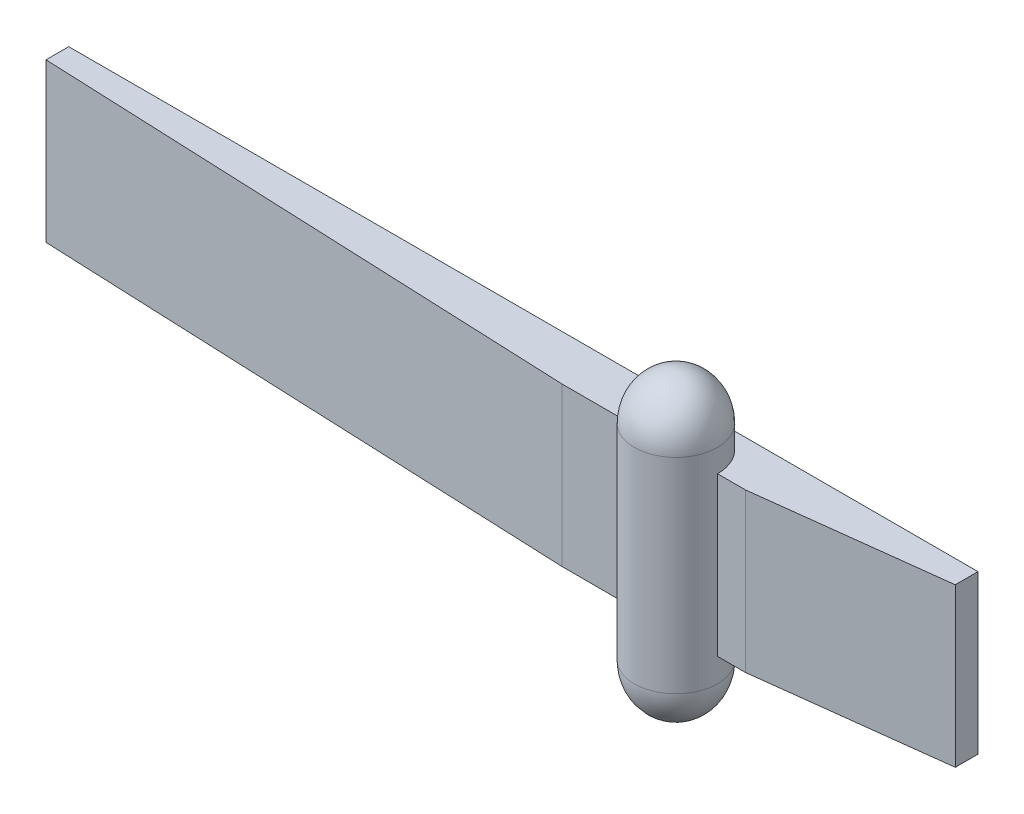
ISO-10303-21;
HEADER;
FILE_DESCRIPTION(('STEP AP214'),'2;1');
FILE_NAME('part.step','',(''),(''),'','','');
FILE_SCHEMA(('AUTOMOTIVE_DESIGN { 1 0 10303 214 1 1 1 1 }'));
ENDSEC;
DATA;
#1=APPLICATION_CONTEXT('core data for automotive mechanical design processes');
#2=APPLICATION_PROTOCOL_DEFINITION('international standard','automotive_design',2000,#1);
#3=PRODUCT_CONTEXT('',#1,'mechanical');
#4=PRODUCT('Part','Part','',(#3));
#5=PRODUCT_RELATED_PRODUCT_CATEGORY('part','',(#4));
#6=PRODUCT_DEFINITION_FORMATION('','',#4);
#7=PRODUCT_DEFINITION_CONTEXT('part definition',#1,'design');
#8=PRODUCT_DEFINITION('design','',#6,#7);
#9=PRODUCT_DEFINITION_SHAPE('','',#8);
#10=(LENGTH_UNIT() NAMED_UNIT(*) SI_UNIT(.MILLI.,.METRE.));
#11=(NAMED_UNIT(*) PLANE_ANGLE_UNIT() SI_UNIT($,.RADIAN.));
#12=(NAMED_UNIT(*) SI_UNIT($,.STERADIAN.) SOLID_ANGLE_UNIT());
#13=UNCERTAINTY_MEASURE_WITH_UNIT(LENGTH_MEASURE(1.E-05),#10,'distance_accuracy_value','');
#14=(GEOMETRIC_REPRESENTATION_CONTEXT(3) GLOBAL_UNCERTAINTY_ASSIGNED_CONTEXT((#13)) GLOBAL_UNIT_ASSIGNED_CONTEXT((#10,
#11,#12)) REPRESENTATION_CONTEXT('',''));
#15=CARTESIAN_POINT('',(0.,0.,0.));
#16=DIRECTION('',(0.,0.,1.));
#17=DIRECTION('',(1.,0.,0.));
#18=AXIS2_PLACEMENT_3D('',#15,#16,#17);
#19=CARTESIAN_POINT('',(0.,0.,10.));
#20=DIRECTION('',(0.,0.,1.));
#21=DIRECTION('',(1.,0.,0.));
#22=AXIS2_PLACEMENT_3D('',#19,#20,#21);
#23=PLANE('',#22);
#24=DIRECTION('',(0.,1.,0.));
#25=VECTOR('',#24,1.);
#26=CARTESIAN_POINT('',(102.312904094759,-41.9286147711512,10.));
#27=LINE('',#26,#25);
#28=CARTESIAN_POINT('',(102.312904094759,-22.6942042302358,10.));
#29=VERTEX_POINT('',#28);
#30=CARTESIAN_POINT('',(102.312904094759,12.0713852288488,10.));
#31=VERTEX_POINT('',#30);
#32=EDGE_CURVE('E105',#29,#31,#27,.T.);
#33=ORIENTED_EDGE('',*,*,#32,.T.);
#34=DIRECTION('',(-1.,0.,0.));
#35=VECTOR('',#34,1.);
#36=CARTESIAN_POINT('',(-56.4940828710125,12.0713852288488,10.));
#37=LINE('',#36,#35);
#38=CARTESIAN_POINT('',(96.1433959163722,12.0713852288488,10.));
#39=VERTEX_POINT('',#38);
#40=EDGE_CURVE('E113',#31,#39,#37,.T.);
#41=ORIENTED_EDGE('',*,*,#40,.T.);
#42=DIRECTION('',(0.,1.,0.));
#43=VECTOR('',#42,1.);
#44=CARTESIAN_POINT('',(96.1433959163723,-27.9286147711512,10.));
#45=LINE('',#44,#43);
#46=CARTESIAN_POINT('',(96.1433959163722,-22.6942042302358,10.));
#47=VERTEX_POINT('',#46);
#48=EDGE_CURVE('E43',#47,#39,#45,.T.);
#49=ORIENTED_EDGE('',*,*,#48,.F.);
#50=DIRECTION('',(1.,0.,0.));
#51=VECTOR('',#50,1.);
#52=CARTESIAN_POINT('',(-56.4940828710125,-22.6942042302358,10.));
#53=LINE('',#52,#51);
#54=EDGE_CURVE('E116',#47,#29,#53,.T.);
#55=ORIENTED_EDGE('',*,*,#54,.T.);
#56=EDGE_LOOP('',(#33,#41,#49,#55));
#57=FACE_BOUND('',#56,.T.);
#58=ADVANCED_FACE('F35',(#57),#23,.T.);
#59=CARTESIAN_POINT('',(-56.4940828710125,12.0713852288488,10.));
#60=DIRECTION('',(1.,0.,0.));
#61=DIRECTION('',(0.,0.,-1.));
#62=AXIS2_PLACEMENT_3D('',#59,#60,#61);
#63=PLANE('',#62);
#64=DIRECTION('',(0.,0.,-1.));
#65=VECTOR('',#64,1.);
#66=CARTESIAN_POINT('',(-56.4940828710125,-22.6942042302358,10.));
#67=LINE('',#66,#65);
#68=CARTESIAN_POINT('',(-56.4940828710125,-22.6942042302358,5.));
#69=VERTEX_POINT('',#68);
#70=CARTESIAN_POINT('',(-56.4940828710125,-22.6942042302358,0.));
#71=VERTEX_POINT('',#70);
#72=EDGE_CURVE('E150',#69,#71,#67,.T.);
#73=ORIENTED_EDGE('',*,*,#72,.F.);
#74=DIRECTION('',(0.,1.,0.));
#75=VECTOR('',#74,1.);
#76=CARTESIAN_POINT('',(-56.4940828710125,-41.9286147711512,5.));
#77=LINE('',#76,#75);
#78=CARTESIAN_POINT('',(-56.4940828710125,12.0713852288488,5.));
#79=VERTEX_POINT('',#78);
#80=EDGE_CURVE('E279',#69,#79,#77,.T.);
#81=ORIENTED_EDGE('',*,*,#80,.T.);
#82=DIRECTION('',(0.,0.,-1.));
#83=VECTOR('',#82,1.);
#84=CARTESIAN_POINT('',(-56.4940828710125,12.0713852288488,10.));
#85=LINE('',#84,#83);
#86=CARTESIAN_POINT('',(-56.4940828710125,12.0713852288488,0.));
#87=VERTEX_POINT('',#86);
#88=EDGE_CURVE('E124',#79,#87,#85,.T.);
#89=ORIENTED_EDGE('',*,*,#88,.T.);
#90=DIRECTION('',(0.,-1.,0.));
#91=VECTOR('',#90,1.);
#92=CARTESIAN_POINT('',(-56.4940828710125,12.0713852288488,0.));
#93=LINE('',#92,#91);
#94=EDGE_CURVE('E134',#87,#71,#93,.T.);
#95=ORIENTED_EDGE('',*,*,#94,.T.);
#96=EDGE_LOOP('',(#73,#81,#89,#95));
#97=FACE_BOUND('',#96,.T.);
#98=ADVANCED_FACE('F167',(#97),#63,.F.);
#99=CARTESIAN_POINT('',(-56.4940828710125,-22.6942042302358,10.));
#100=DIRECTION('',(0.,1.,0.));
#101=DIRECTION('',(0.,0.,1.));
#102=AXIS2_PLACEMENT_3D('',#99,#100,#101);
#103=PLANE('',#102);
#104=DIRECTION('',(0.,0.,-1.));
#105=VECTOR('',#104,1.);
#106=CARTESIAN_POINT('',(143.408056518724,-22.6942042302358,10.));
#107=LINE('',#106,#105);
#108=CARTESIAN_POINT('',(143.408056518724,-22.6942042302358,5.));
#109=VERTEX_POINT('',#108);
#110=CARTESIAN_POINT('',(143.408056518724,-22.6942042302358,0.));
#111=VERTEX_POINT('',#110);
#112=EDGE_CURVE('E148',#109,#111,#107,.T.);
#113=ORIENTED_EDGE('',*,*,#112,.F.);
#114=DIRECTION('',(-0.992679521237755,0.,0.120778177313546));
#115=VECTOR('',#114,1.);
#116=CARTESIAN_POINT('',(-54.1775068928798,-22.6942042302358,29.0400085846113));
#117=LINE('',#116,#115);
#118=EDGE_CURVE('E117',#109,#29,#117,.T.);
#119=ORIENTED_EDGE('',*,*,#118,.T.);
#120=ORIENTED_EDGE('',*,*,#54,.F.);
#121=CARTESIAN_POINT('',(86.9997808302578,-22.6942042302358,10.));
#122=DIRECTION('',(0.,1.,0.));
#123=DIRECTION('',(0.,0.,1.));
#124=AXIS2_PLACEMENT_3D('',#121,#122,#123);
#125=CIRCLE('',#124,9.14361508611443);
#126=CARTESIAN_POINT('',(77.8561657441434,-22.6942042302358,10.));
#127=VERTEX_POINT('',#126);
#128=EDGE_CURVE('E138',#47,#127,#125,.T.);
#129=ORIENTED_EDGE('',*,*,#128,.T.);
#130=CARTESIAN_POINT('',(61.9887011513924,-22.6942042302358,10.));
#131=VERTEX_POINT('',#130);
#132=EDGE_CURVE('E130',#131,#127,#53,.T.);
#133=ORIENTED_EDGE('',*,*,#132,.F.);
#134=DIRECTION('',(-0.999110758091058,0.,-0.0421626975739415));
#135=VECTOR('',#134,1.);
#136=CARTESIAN_POINT('',(-56.2834568473312,-22.6942042302358,5.00888846533356));
#137=LINE('',#136,#135);
#138=EDGE_CURVE('E57',#131,#69,#137,.T.);
#139=ORIENTED_EDGE('',*,*,#138,.T.);
#140=ORIENTED_EDGE('',*,*,#72,.T.);
#141=DIRECTION('',(1.,0.,0.));
#142=VECTOR('',#141,1.);
#143=CARTESIAN_POINT('',(-56.4940828710125,-22.6942042302358,0.));
#144=LINE('',#143,#142);
#145=EDGE_CURVE('E137',#71,#111,#144,.T.);
#146=ORIENTED_EDGE('',*,*,#145,.T.);
#147=EDGE_LOOP('',(#113,#119,#120,#129,#133,#139,#140,#146));
#148=FACE_BOUND('',#147,.T.);
#149=ADVANCED_FACE('F170',(#148),#103,.F.);
#150=CARTESIAN_POINT('',(143.408056518724,12.0713852288488,10.));
#151=DIRECTION('',(-1.,0.,0.));
#152=DIRECTION('',(0.,0.,1.));
#153=AXIS2_PLACEMENT_3D('',#150,#151,#152);
#154=PLANE('',#153);
#155=DIRECTION('',(0.,0.,-1.));
#156=VECTOR('',#155,1.);
#157=CARTESIAN_POINT('',(143.408056518724,12.0713852288488,10.));
#158=LINE('',#157,#156);
#159=CARTESIAN_POINT('',(143.408056518724,12.0713852288488,4.99999999999999));
#160=VERTEX_POINT('',#159);
#161=CARTESIAN_POINT('',(143.408056518724,12.0713852288488,0.));
#162=VERTEX_POINT('',#161);
#163=EDGE_CURVE('E127',#160,#162,#158,.T.);
#164=ORIENTED_EDGE('',*,*,#163,.F.);
#165=DIRECTION('',(0.,1.,0.));
#166=VECTOR('',#165,1.);
#167=CARTESIAN_POINT('',(143.408056518724,-41.9286147711512,5.));
#168=LINE('',#167,#166);
#169=EDGE_CURVE('E50',#109,#160,#168,.T.);
#170=ORIENTED_EDGE('',*,*,#169,.F.);
#171=ORIENTED_EDGE('',*,*,#112,.T.);
#172=DIRECTION('',(0.,1.,0.));
#173=VECTOR('',#172,1.);
#174=CARTESIAN_POINT('',(143.408056518724,12.0713852288488,0.));
#175=LINE('',#174,#173);
#176=EDGE_CURVE('E141',#111,#162,#175,.T.);
#177=ORIENTED_EDGE('',*,*,#176,.T.);
#178=EDGE_LOOP('',(#164,#170,#171,#177));
#179=FACE_BOUND('',#178,.T.);
#180=ADVANCED_FACE('F174',(#179),#154,.F.);
#181=CARTESIAN_POINT('',(-56.4940828710125,12.0713852288488,10.));
#182=DIRECTION('',(0.,-1.,0.));
#183=DIRECTION('',(0.,0.,-1.));
#184=AXIS2_PLACEMENT_3D('',#181,#182,#183);
#185=PLANE('',#184);
#186=ORIENTED_EDGE('',*,*,#40,.F.);
#187=DIRECTION('',(-0.992679521237755,0.,0.120778177313546));
#188=VECTOR('',#187,1.);
#189=CARTESIAN_POINT('',(143.408056518724,12.0713852288488,5.));
#190=LINE('',#189,#188);
#191=EDGE_CURVE('E102',#160,#31,#190,.T.);
#192=ORIENTED_EDGE('',*,*,#191,.F.);
#193=ORIENTED_EDGE('',*,*,#163,.T.);
#194=DIRECTION('',(-1.,0.,0.));
#195=VECTOR('',#194,1.);
#196=CARTESIAN_POINT('',(-56.4940828710125,12.0713852288488,0.));
#197=LINE('',#196,#195);
#198=EDGE_CURVE('E144',#162,#87,#197,.T.);
#199=ORIENTED_EDGE('',*,*,#198,.T.);
#200=ORIENTED_EDGE('',*,*,#88,.F.);
#201=DIRECTION('',(-0.999110758091058,0.,-0.0421626975739415));
#202=VECTOR('',#201,1.);
#203=CARTESIAN_POINT('',(-56.4940828710125,12.0713852288488,5.));
#204=LINE('',#203,#202);
#205=CARTESIAN_POINT('',(61.9887011513924,12.0713852288488,10.));
#206=VERTEX_POINT('',#205);
#207=EDGE_CURVE('E282',#206,#79,#204,.T.);
#208=ORIENTED_EDGE('',*,*,#207,.F.);
#209=CARTESIAN_POINT('',(77.8561657441434,12.0713852288488,10.));
#210=VERTEX_POINT('',#209);
#211=EDGE_CURVE('E125',#210,#206,#37,.T.);
#212=ORIENTED_EDGE('',*,*,#211,.F.);
#213=CARTESIAN_POINT('',(86.9997808302578,12.0713852288488,10.));
#214=DIRECTION('',(0.,-1.,0.));
#215=DIRECTION('',(0.,0.,-1.));
#216=AXIS2_PLACEMENT_3D('',#213,#214,#215);
#217=CIRCLE('',#216,9.14361508611443);
#218=EDGE_CURVE('E122',#210,#39,#217,.T.);
#219=ORIENTED_EDGE('',*,*,#218,.T.);
#220=EDGE_LOOP('',(#186,#192,#193,#199,#200,#208,#212,#219));
#221=FACE_BOUND('',#220,.T.);
#222=ADVANCED_FACE('F119',(#221),#185,.F.);
#223=DIRECTION('',(0.,1.,0.));
#224=VECTOR('',#223,1.);
#225=CARTESIAN_POINT('',(61.9887011513924,0.,10.));
#226=LINE('',#225,#224);
#227=EDGE_CURVE('E11',#131,#206,#226,.T.);
#228=ORIENTED_EDGE('',*,*,#227,.F.);
#229=ORIENTED_EDGE('',*,*,#132,.T.);
#230=DIRECTION('',(0.,1.,0.));
#231=VECTOR('',#230,1.);
#232=CARTESIAN_POINT('',(77.8561657441434,-27.9286147711512,10.));
#233=LINE('',#232,#231);
#234=EDGE_CURVE('E152',#210,#127,#233,.F.);
#235=ORIENTED_EDGE('',*,*,#234,.F.);
#236=ORIENTED_EDGE('',*,*,#211,.T.);
#237=EDGE_LOOP('',(#228,#229,#235,#236));
#238=FACE_BOUND('',#237,.T.);
#239=ADVANCED_FACE('F181',(#238),#23,.T.);
#240=CARTESIAN_POINT('',(0.,0.,0.));
#241=DIRECTION('',(0.,0.,1.));
#242=DIRECTION('',(1.,0.,0.));
#243=AXIS2_PLACEMENT_3D('',#240,#241,#242);
#244=PLANE('',#243);
#245=ORIENTED_EDGE('',*,*,#94,.F.);
#246=ORIENTED_EDGE('',*,*,#198,.F.);
#247=ORIENTED_EDGE('',*,*,#176,.F.);
#248=ORIENTED_EDGE('',*,*,#145,.F.);
#249=EDGE_LOOP('',(#245,#246,#247,#248));
#250=FACE_BOUND('',#249,.T.);
#251=ADVANCED_FACE('F182',(#250),#244,.F.);
#252=CARTESIAN_POINT('',(86.9997808302578,-27.9286147711512,10.));
#253=DIRECTION('',(0.,1.,0.));
#254=DIRECTION('',(0.,0.,1.));
#255=AXIS2_PLACEMENT_3D('',#252,#253,#254);
#256=CYLINDRICAL_SURFACE('',#255,9.14361508611443);
#257=ORIENTED_EDGE('',*,*,#128,.F.);
#258=ORIENTED_EDGE('',*,*,#48,.T.);
#259=ORIENTED_EDGE('',*,*,#218,.F.);
#260=ORIENTED_EDGE('',*,*,#234,.T.);
#261=EDGE_LOOP('',(#257,#258,#259,#260));
#262=FACE_BOUND('',#261,.T.);
#263=CARTESIAN_POINT('',(86.9997808302578,-27.9286147711512,10.));
#264=DIRECTION('',(0.,1.,0.));
#265=DIRECTION('',(0.,0.,1.));
#266=AXIS2_PLACEMENT_3D('',#263,#264,#265);
#267=CIRCLE('',#266,9.14361508611443);
#268=CARTESIAN_POINT('',(86.9997808302578,-27.9286147711512,19.1436150861144));
#269=VERTEX_POINT('',#268);
#270=EDGE_CURVE('E159',#269,#269,#267,.T.);
#271=ORIENTED_EDGE('',*,*,#270,.T.);
#272=EDGE_LOOP('',(#271));
#273=FACE_BOUND('',#272,.T.);
#274=CARTESIAN_POINT('',(86.9997808302578,17.0713852288488,10.));
#275=DIRECTION('',(0.,1.,0.));
#276=DIRECTION('',(0.,0.,1.));
#277=AXIS2_PLACEMENT_3D('',#274,#275,#276);
#278=CIRCLE('',#277,9.14361508611443);
#279=CARTESIAN_POINT('',(86.9997808302578,17.0713852288488,19.1436150861144));
#280=VERTEX_POINT('',#279);
#281=EDGE_CURVE('E156',#280,#280,#278,.T.);
#282=ORIENTED_EDGE('',*,*,#281,.F.);
#283=EDGE_LOOP('',(#282));
#284=FACE_BOUND('',#283,.T.);
#285=ADVANCED_FACE('F185',(#262,#273,#284),#256,.T.);
#286=CARTESIAN_POINT('',(86.9997808302578,-27.9286147711512,10.));
#287=DIRECTION('',(-1.,0.,0.));
#288=DIRECTION('',(0.,-1.,0.));
#289=AXIS2_PLACEMENT_3D('',#286,#287,#288);
#290=ELLIPSE('',#289,10.,9.14361508611443);
#291=TRIMMED_CURVE('',#290,(PARAMETER_VALUE(0.)),(PARAMETER_VALUE(3.14159265358979)),.T.,.PARAMETER.);
#292=CARTESIAN_POINT('',(86.9997808302578,-17.9286147711512,10.));
#293=DIRECTION('',(0.,-1.,0.));
#294=AXIS1_PLACEMENT('',#292,#293);
#295=SURFACE_OF_REVOLUTION('',#291,#294);
#296=CARTESIAN_POINT('',(86.9997808302578,-37.9286147711512,10.));
#297=VERTEX_POINT('',#296);
#298=VERTEX_LOOP('',#297);
#299=FACE_BOUND('',#298,.T.);
#300=ORIENTED_EDGE('',*,*,#270,.F.);
#301=EDGE_LOOP('',(#300));
#302=FACE_BOUND('',#301,.T.);
#303=ADVANCED_FACE('F37',(#299,#302),#295,.F.);
#304=CARTESIAN_POINT('',(86.9997808302578,17.0713852288488,10.));
#305=DIRECTION('',(1.,0.,0.));
#306=DIRECTION('',(0.,1.,0.));
#307=AXIS2_PLACEMENT_3D('',#304,#305,#306);
#308=ELLIPSE('',#307,10.,9.14361508611443);
#309=TRIMMED_CURVE('',#308,(PARAMETER_VALUE(0.)),(PARAMETER_VALUE(3.14159265358979)),.T.,.PARAMETER.);
#310=CARTESIAN_POINT('',(86.9997808302578,7.07138522884881,10.));
#311=DIRECTION('',(0.,1.,0.));
#312=AXIS1_PLACEMENT('',#310,#311);
#313=SURFACE_OF_REVOLUTION('',#309,#312);
#314=CARTESIAN_POINT('',(86.9997808302578,27.0713852288488,10.));
#315=VERTEX_POINT('',#314);
#316=VERTEX_LOOP('',#315);
#317=FACE_BOUND('',#316,.T.);
#318=ORIENTED_EDGE('',*,*,#281,.T.);
#319=EDGE_LOOP('',(#318));
#320=FACE_BOUND('',#319,.T.);
#321=ADVANCED_FACE('F162',(#317,#320),#313,.F.);
#322=CARTESIAN_POINT('',(-56.4940828710125,-41.9286147711512,5.));
#323=DIRECTION('',(0.0421626975739415,0.,-0.999110758091058));
#324=DIRECTION('',(-0.999110758091058,0.,-0.0421626975739415));
#325=AXIS2_PLACEMENT_3D('',#322,#323,#324);
#326=PLANE('',#325);
#327=ORIENTED_EDGE('',*,*,#227,.T.);
#328=ORIENTED_EDGE('',*,*,#207,.T.);
#329=ORIENTED_EDGE('',*,*,#80,.F.);
#330=ORIENTED_EDGE('',*,*,#138,.F.);
#331=EDGE_LOOP('',(#327,#328,#329,#330));
#332=FACE_BOUND('',#331,.T.);
#333=ADVANCED_FACE('F165',(#332),#326,.F.);
#334=CARTESIAN_POINT('',(143.408056518724,-41.9286147711512,5.));
#335=DIRECTION('',(-0.120778177313546,0.,-0.992679521237755));
#336=DIRECTION('',(-0.992679521237755,0.,0.120778177313546));
#337=AXIS2_PLACEMENT_3D('',#334,#335,#336);
#338=PLANE('',#337);
#339=ORIENTED_EDGE('',*,*,#169,.T.);
#340=ORIENTED_EDGE('',*,*,#191,.T.);
#341=ORIENTED_EDGE('',*,*,#32,.F.);
#342=ORIENTED_EDGE('',*,*,#118,.F.);
#343=EDGE_LOOP('',(#339,#340,#341,#342));
#344=FACE_BOUND('',#343,.T.);
#345=ADVANCED_FACE('F104',(#344),#338,.F.);
#346=CLOSED_SHELL('',(#58,#98,#149,#180,#222,#239,#251,#285,#303,#321,#333,#345));
#347=MANIFOLD_SOLID_BREP('B2',#346);
#348=ADVANCED_BREP_SHAPE_REPRESENTATION('',(#18,#347),#14);
#349=SHAPE_DEFINITION_REPRESENTATION(#9,#348);
ENDSEC;
END-ISO-10303-21;
